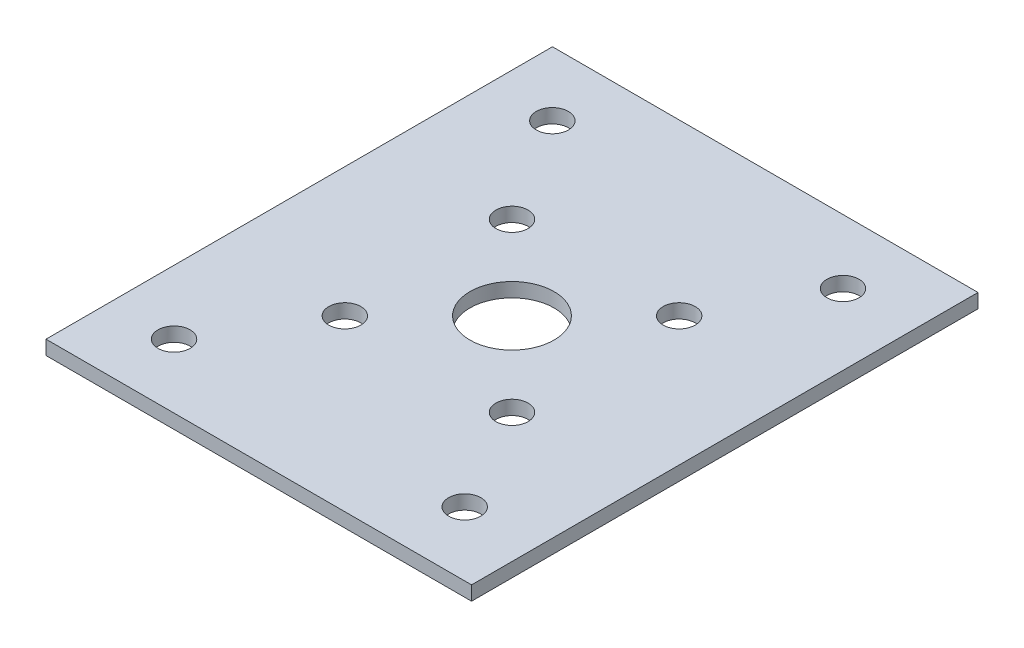
ISO-10303-21;
HEADER;
FILE_DESCRIPTION(('STEP AP214'),'2;1');
FILE_NAME('part.step','',(''),(''),'','','');
FILE_SCHEMA(('AUTOMOTIVE_DESIGN { 1 0 10303 214 1 1 1 1 }'));
ENDSEC;
DATA;
#1=APPLICATION_CONTEXT('core data for automotive mechanical design processes');
#2=APPLICATION_PROTOCOL_DEFINITION('international standard','automotive_design',2000,#1);
#3=PRODUCT_CONTEXT('',#1,'mechanical');
#4=PRODUCT('Part','Part','',(#3));
#5=PRODUCT_RELATED_PRODUCT_CATEGORY('part','',(#4));
#6=PRODUCT_DEFINITION_FORMATION('','',#4);
#7=PRODUCT_DEFINITION_CONTEXT('part definition',#1,'design');
#8=PRODUCT_DEFINITION('design','',#6,#7);
#9=PRODUCT_DEFINITION_SHAPE('','',#8);
#10=(LENGTH_UNIT() NAMED_UNIT(*) SI_UNIT(.MILLI.,.METRE.));
#11=(NAMED_UNIT(*) PLANE_ANGLE_UNIT() SI_UNIT($,.RADIAN.));
#12=(NAMED_UNIT(*) SI_UNIT($,.STERADIAN.) SOLID_ANGLE_UNIT());
#13=UNCERTAINTY_MEASURE_WITH_UNIT(LENGTH_MEASURE(1.E-05),#10,'distance_accuracy_value','');
#14=(GEOMETRIC_REPRESENTATION_CONTEXT(3) GLOBAL_UNCERTAINTY_ASSIGNED_CONTEXT((#13)) GLOBAL_UNIT_ASSIGNED_CONTEXT((#10,
#11,#12)) REPRESENTATION_CONTEXT('',''));
#15=CARTESIAN_POINT('',(0.,0.,0.));
#16=DIRECTION('',(0.,0.,1.));
#17=DIRECTION('',(1.,0.,0.));
#18=AXIS2_PLACEMENT_3D('',#15,#16,#17);
#19=CARTESIAN_POINT('',(0.,1.5,0.));
#20=DIRECTION('',(0.,-1.,0.));
#21=DIRECTION('',(0.,0.,-1.));
#22=AXIS2_PLACEMENT_3D('',#19,#20,#21);
#23=PLANE('',#22);
#24=CARTESIAN_POINT('',(0.,1.5,0.));
#25=DIRECTION('',(0.,1.,0.));
#26=DIRECTION('',(0.,0.,1.));
#27=AXIS2_PLACEMENT_3D('',#24,#25,#26);
#28=CIRCLE('',#27,4.445);
#29=CARTESIAN_POINT('',(0.,1.5,4.445));
#30=VERTEX_POINT('',#29);
#31=EDGE_CURVE('E159',#30,#30,#28,.T.);
#32=ORIENTED_EDGE('',*,*,#31,.F.);
#33=EDGE_LOOP('',(#32));
#34=FACE_BOUND('',#33,.T.);
#35=CARTESIAN_POINT('',(-8.8388347648318,1.5,-8.83883476483189));
#36=DIRECTION('',(0.,1.,0.));
#37=DIRECTION('',(0.,0.,1.));
#38=AXIS2_PLACEMENT_3D('',#35,#36,#37);
#39=CIRCLE('',#38,1.7);
#40=CARTESIAN_POINT('',(-8.8388347648318,1.5,-7.13883476483189));
#41=VERTEX_POINT('',#40);
#42=EDGE_CURVE('E156',#41,#41,#39,.T.);
#43=ORIENTED_EDGE('',*,*,#42,.F.);
#44=EDGE_LOOP('',(#43));
#45=FACE_BOUND('',#44,.T.);
#46=CARTESIAN_POINT('',(8.8388347648318,1.5,8.83883476483189));
#47=DIRECTION('',(0.,1.,0.));
#48=DIRECTION('',(0.,0.,1.));
#49=AXIS2_PLACEMENT_3D('',#46,#47,#48);
#50=CIRCLE('',#49,1.7);
#51=CARTESIAN_POINT('',(8.8388347648318,1.5,10.5388347648319));
#52=VERTEX_POINT('',#51);
#53=EDGE_CURVE('E150',#52,#52,#50,.T.);
#54=ORIENTED_EDGE('',*,*,#53,.F.);
#55=EDGE_LOOP('',(#54));
#56=FACE_BOUND('',#55,.T.);
#57=CARTESIAN_POINT('',(8.83883476483186,1.5,-8.83883476483183));
#58=DIRECTION('',(0.,1.,0.));
#59=DIRECTION('',(0.,0.,1.));
#60=AXIS2_PLACEMENT_3D('',#57,#58,#59);
#61=CIRCLE('',#60,1.7);
#62=CARTESIAN_POINT('',(8.83883476483186,1.5,-7.13883476483183));
#63=VERTEX_POINT('',#62);
#64=EDGE_CURVE('E144',#63,#63,#61,.T.);
#65=ORIENTED_EDGE('',*,*,#64,.F.);
#66=EDGE_LOOP('',(#65));
#67=FACE_BOUND('',#66,.T.);
#68=CARTESIAN_POINT('',(-8.83883476483186,1.5,8.83883476483183));
#69=DIRECTION('',(0.,1.,0.));
#70=DIRECTION('',(0.,0.,1.));
#71=AXIS2_PLACEMENT_3D('',#68,#69,#70);
#72=CIRCLE('',#71,1.7);
#73=CARTESIAN_POINT('',(-8.83883476483186,1.5,10.5388347648318));
#74=VERTEX_POINT('',#73);
#75=EDGE_CURVE('E138',#74,#74,#72,.T.);
#76=ORIENTED_EDGE('',*,*,#75,.F.);
#77=EDGE_LOOP('',(#76));
#78=FACE_BOUND('',#77,.T.);
#79=CARTESIAN_POINT('',(15.,1.5,20.));
#80=DIRECTION('',(0.,1.,0.));
#81=DIRECTION('',(0.,0.,1.));
#82=AXIS2_PLACEMENT_3D('',#79,#80,#81);
#83=CIRCLE('',#82,1.69999999999999);
#84=CARTESIAN_POINT('',(15.,1.5,21.7));
#85=VERTEX_POINT('',#84);
#86=EDGE_CURVE('E120',#85,#85,#83,.T.);
#87=ORIENTED_EDGE('',*,*,#86,.F.);
#88=EDGE_LOOP('',(#87));
#89=FACE_BOUND('',#88,.T.);
#90=DIRECTION('',(0.,0.,-1.));
#91=VECTOR('',#90,1.);
#92=CARTESIAN_POINT('',(22.5,1.5,26.778000038));
#93=LINE('',#92,#91);
#94=CARTESIAN_POINT('',(22.5,1.5,26.778000038));
#95=VERTEX_POINT('',#94);
#96=CARTESIAN_POINT('',(22.5,1.5,-26.778000038));
#97=VERTEX_POINT('',#96);
#98=EDGE_CURVE('E86',#95,#97,#93,.T.);
#99=ORIENTED_EDGE('',*,*,#98,.T.);
#100=DIRECTION('',(-1.,0.,0.));
#101=VECTOR('',#100,1.);
#102=CARTESIAN_POINT('',(-22.5,1.5,-26.778000038));
#103=LINE('',#102,#101);
#104=CARTESIAN_POINT('',(-22.5,1.5,-26.778000038));
#105=VERTEX_POINT('',#104);
#106=EDGE_CURVE('E81',#97,#105,#103,.T.);
#107=ORIENTED_EDGE('',*,*,#106,.T.);
#108=DIRECTION('',(0.,0.,1.));
#109=VECTOR('',#108,1.);
#110=CARTESIAN_POINT('',(-22.5,1.5,26.778000038));
#111=LINE('',#110,#109);
#112=CARTESIAN_POINT('',(-22.5,1.5,26.778000038));
#113=VERTEX_POINT('',#112);
#114=EDGE_CURVE('E84',#105,#113,#111,.T.);
#115=ORIENTED_EDGE('',*,*,#114,.T.);
#116=DIRECTION('',(1.,0.,0.));
#117=VECTOR('',#116,1.);
#118=CARTESIAN_POINT('',(-22.5,1.5,26.778000038));
#119=LINE('',#118,#117);
#120=EDGE_CURVE('E51',#113,#95,#119,.T.);
#121=ORIENTED_EDGE('',*,*,#120,.T.);
#122=EDGE_LOOP('',(#99,#107,#115,#121));
#123=FACE_BOUND('',#122,.T.);
#124=CARTESIAN_POINT('',(-15.736599944,1.5,20.));
#125=DIRECTION('',(0.,1.,0.));
#126=DIRECTION('',(0.,0.,1.));
#127=AXIS2_PLACEMENT_3D('',#124,#125,#126);
#128=CIRCLE('',#127,1.69999999999999);
#129=CARTESIAN_POINT('',(-15.736599944,1.5,21.7));
#130=VERTEX_POINT('',#129);
#131=EDGE_CURVE('E114',#130,#130,#128,.T.);
#132=ORIENTED_EDGE('',*,*,#131,.F.);
#133=EDGE_LOOP('',(#132));
#134=FACE_BOUND('',#133,.T.);
#135=CARTESIAN_POINT('',(15.,1.5,-20.));
#136=DIRECTION('',(0.,1.,0.));
#137=DIRECTION('',(0.,0.,1.));
#138=AXIS2_PLACEMENT_3D('',#135,#136,#137);
#139=CIRCLE('',#138,1.69999999999999);
#140=CARTESIAN_POINT('',(15.,1.5,-18.3));
#141=VERTEX_POINT('',#140);
#142=EDGE_CURVE('E126',#141,#141,#139,.T.);
#143=ORIENTED_EDGE('',*,*,#142,.F.);
#144=EDGE_LOOP('',(#143));
#145=FACE_BOUND('',#144,.T.);
#146=CARTESIAN_POINT('',(-15.736599944,1.5,-20.));
#147=DIRECTION('',(0.,1.,0.));
#148=DIRECTION('',(0.,0.,1.));
#149=AXIS2_PLACEMENT_3D('',#146,#147,#148);
#150=CIRCLE('',#149,1.69999999999999);
#151=CARTESIAN_POINT('',(-15.736599944,1.5,-18.3));
#152=VERTEX_POINT('',#151);
#153=EDGE_CURVE('E132',#152,#152,#150,.T.);
#154=ORIENTED_EDGE('',*,*,#153,.F.);
#155=EDGE_LOOP('',(#154));
#156=FACE_BOUND('',#155,.T.);
#157=ADVANCED_FACE('F34',(#34,#45,#56,#67,#78,#89,#123,#134,#145,#156),#23,.F.);
#158=CARTESIAN_POINT('',(22.5,1.5,26.778000038));
#159=DIRECTION('',(-1.,0.,0.));
#160=DIRECTION('',(0.,0.,1.));
#161=AXIS2_PLACEMENT_3D('',#158,#159,#160);
#162=PLANE('',#161);
#163=DIRECTION('',(0.,0.,-1.));
#164=VECTOR('',#163,1.);
#165=CARTESIAN_POINT('',(22.5,0.,26.778000038));
#166=LINE('',#165,#164);
#167=CARTESIAN_POINT('',(22.5,0.,26.778000038));
#168=VERTEX_POINT('',#167);
#169=CARTESIAN_POINT('',(22.5,0.,-26.778000038));
#170=VERTEX_POINT('',#169);
#171=EDGE_CURVE('E98',#168,#170,#166,.T.);
#172=ORIENTED_EDGE('',*,*,#171,.T.);
#173=DIRECTION('',(0.,-1.,0.));
#174=VECTOR('',#173,1.);
#175=CARTESIAN_POINT('',(22.5,1.5,-26.778000038));
#176=LINE('',#175,#174);
#177=EDGE_CURVE('E11',#97,#170,#176,.T.);
#178=ORIENTED_EDGE('',*,*,#177,.F.);
#179=ORIENTED_EDGE('',*,*,#98,.F.);
#180=DIRECTION('',(0.,-1.,0.));
#181=VECTOR('',#180,1.);
#182=CARTESIAN_POINT('',(22.5,1.5,26.778000038));
#183=LINE('',#182,#181);
#184=EDGE_CURVE('E94',#95,#168,#183,.T.);
#185=ORIENTED_EDGE('',*,*,#184,.T.);
#186=EDGE_LOOP('',(#172,#178,#179,#185));
#187=FACE_BOUND('',#186,.T.);
#188=ADVANCED_FACE('F36',(#187),#162,.F.);
#189=CARTESIAN_POINT('',(-22.5,1.5,-26.778000038));
#190=DIRECTION('',(0.,0.,1.));
#191=DIRECTION('',(1.,0.,0.));
#192=AXIS2_PLACEMENT_3D('',#189,#190,#191);
#193=PLANE('',#192);
#194=DIRECTION('',(-1.,0.,0.));
#195=VECTOR('',#194,1.);
#196=CARTESIAN_POINT('',(-22.5,0.,-26.778000038));
#197=LINE('',#196,#195);
#198=CARTESIAN_POINT('',(-22.5,0.,-26.778000038));
#199=VERTEX_POINT('',#198);
#200=EDGE_CURVE('E90',#170,#199,#197,.T.);
#201=ORIENTED_EDGE('',*,*,#200,.T.);
#202=DIRECTION('',(0.,-1.,0.));
#203=VECTOR('',#202,1.);
#204=CARTESIAN_POINT('',(-22.5,1.5,-26.778000038));
#205=LINE('',#204,#203);
#206=EDGE_CURVE('E43',#105,#199,#205,.T.);
#207=ORIENTED_EDGE('',*,*,#206,.F.);
#208=ORIENTED_EDGE('',*,*,#106,.F.);
#209=ORIENTED_EDGE('',*,*,#177,.T.);
#210=EDGE_LOOP('',(#201,#207,#208,#209));
#211=FACE_BOUND('',#210,.T.);
#212=ADVANCED_FACE('F89',(#211),#193,.F.);
#213=CARTESIAN_POINT('',(-22.5,1.5,26.778000038));
#214=DIRECTION('',(1.,0.,0.));
#215=DIRECTION('',(0.,0.,-1.));
#216=AXIS2_PLACEMENT_3D('',#213,#214,#215);
#217=PLANE('',#216);
#218=DIRECTION('',(0.,0.,1.));
#219=VECTOR('',#218,1.);
#220=CARTESIAN_POINT('',(-22.5,0.,26.778000038));
#221=LINE('',#220,#219);
#222=CARTESIAN_POINT('',(-22.5,0.,26.778000038));
#223=VERTEX_POINT('',#222);
#224=EDGE_CURVE('E68',#199,#223,#221,.T.);
#225=ORIENTED_EDGE('',*,*,#224,.T.);
#226=DIRECTION('',(0.,-1.,0.));
#227=VECTOR('',#226,1.);
#228=CARTESIAN_POINT('',(-22.5,1.5,26.778000038));
#229=LINE('',#228,#227);
#230=EDGE_CURVE('E91',#113,#223,#229,.T.);
#231=ORIENTED_EDGE('',*,*,#230,.F.);
#232=ORIENTED_EDGE('',*,*,#114,.F.);
#233=ORIENTED_EDGE('',*,*,#206,.T.);
#234=EDGE_LOOP('',(#225,#231,#232,#233));
#235=FACE_BOUND('',#234,.T.);
#236=ADVANCED_FACE('F92',(#235),#217,.F.);
#237=CARTESIAN_POINT('',(-22.5,1.5,26.778000038));
#238=DIRECTION('',(0.,0.,-1.));
#239=DIRECTION('',(-1.,0.,0.));
#240=AXIS2_PLACEMENT_3D('',#237,#238,#239);
#241=PLANE('',#240);
#242=DIRECTION('',(1.,0.,0.));
#243=VECTOR('',#242,1.);
#244=CARTESIAN_POINT('',(-22.5,0.,26.778000038));
#245=LINE('',#244,#243);
#246=EDGE_CURVE('E74',#223,#168,#245,.T.);
#247=ORIENTED_EDGE('',*,*,#246,.T.);
#248=ORIENTED_EDGE('',*,*,#184,.F.);
#249=ORIENTED_EDGE('',*,*,#120,.F.);
#250=ORIENTED_EDGE('',*,*,#230,.T.);
#251=EDGE_LOOP('',(#247,#248,#249,#250));
#252=FACE_BOUND('',#251,.T.);
#253=ADVANCED_FACE('F106',(#252),#241,.F.);
#254=CARTESIAN_POINT('',(0.,0.,0.));
#255=DIRECTION('',(0.,-1.,0.));
#256=DIRECTION('',(0.,0.,-1.));
#257=AXIS2_PLACEMENT_3D('',#254,#255,#256);
#258=PLANE('',#257);
#259=CARTESIAN_POINT('',(0.,0.,0.));
#260=DIRECTION('',(0.,-1.,0.));
#261=DIRECTION('',(0.,0.,-1.));
#262=AXIS2_PLACEMENT_3D('',#259,#260,#261);
#263=CIRCLE('',#262,4.445);
#264=CARTESIAN_POINT('',(0.,0.,-4.445));
#265=VERTEX_POINT('',#264);
#266=EDGE_CURVE('E160',#265,#265,#263,.F.);
#267=ORIENTED_EDGE('',*,*,#266,.T.);
#268=EDGE_LOOP('',(#267));
#269=FACE_BOUND('',#268,.T.);
#270=CARTESIAN_POINT('',(-8.8388347648318,0.,-8.83883476483189));
#271=DIRECTION('',(0.,1.,0.));
#272=DIRECTION('',(0.,0.,1.));
#273=AXIS2_PLACEMENT_3D('',#270,#271,#272);
#274=CIRCLE('',#273,1.7);
#275=CARTESIAN_POINT('',(-8.8388347648318,0.,-7.13883476483189));
#276=VERTEX_POINT('',#275);
#277=EDGE_CURVE('E153',#276,#276,#274,.T.);
#278=ORIENTED_EDGE('',*,*,#277,.T.);
#279=EDGE_LOOP('',(#278));
#280=FACE_BOUND('',#279,.T.);
#281=CARTESIAN_POINT('',(8.8388347648318,0.,8.83883476483189));
#282=DIRECTION('',(0.,1.,0.));
#283=DIRECTION('',(0.,0.,1.));
#284=AXIS2_PLACEMENT_3D('',#281,#282,#283);
#285=CIRCLE('',#284,1.7);
#286=CARTESIAN_POINT('',(8.8388347648318,0.,10.5388347648319));
#287=VERTEX_POINT('',#286);
#288=EDGE_CURVE('E147',#287,#287,#285,.T.);
#289=ORIENTED_EDGE('',*,*,#288,.T.);
#290=EDGE_LOOP('',(#289));
#291=FACE_BOUND('',#290,.T.);
#292=CARTESIAN_POINT('',(8.83883476483186,0.,-8.83883476483183));
#293=DIRECTION('',(0.,1.,0.));
#294=DIRECTION('',(0.,0.,1.));
#295=AXIS2_PLACEMENT_3D('',#292,#293,#294);
#296=CIRCLE('',#295,1.7);
#297=CARTESIAN_POINT('',(8.83883476483186,0.,-7.13883476483183));
#298=VERTEX_POINT('',#297);
#299=EDGE_CURVE('E141',#298,#298,#296,.T.);
#300=ORIENTED_EDGE('',*,*,#299,.T.);
#301=EDGE_LOOP('',(#300));
#302=FACE_BOUND('',#301,.T.);
#303=CARTESIAN_POINT('',(-8.83883476483186,0.,8.83883476483183));
#304=DIRECTION('',(0.,1.,0.));
#305=DIRECTION('',(0.,0.,1.));
#306=AXIS2_PLACEMENT_3D('',#303,#304,#305);
#307=CIRCLE('',#306,1.7);
#308=CARTESIAN_POINT('',(-8.83883476483186,0.,10.5388347648318));
#309=VERTEX_POINT('',#308);
#310=EDGE_CURVE('E135',#309,#309,#307,.T.);
#311=ORIENTED_EDGE('',*,*,#310,.T.);
#312=EDGE_LOOP('',(#311));
#313=FACE_BOUND('',#312,.T.);
#314=CARTESIAN_POINT('',(-15.736599944,0.,-20.));
#315=DIRECTION('',(0.,-1.,0.));
#316=DIRECTION('',(0.,0.,-1.));
#317=AXIS2_PLACEMENT_3D('',#314,#315,#316);
#318=CIRCLE('',#317,1.69999999999999);
#319=CARTESIAN_POINT('',(-15.736599944,0.,-21.7));
#320=VERTEX_POINT('',#319);
#321=EDGE_CURVE('E129',#320,#320,#318,.T.);
#322=ORIENTED_EDGE('',*,*,#321,.F.);
#323=EDGE_LOOP('',(#322));
#324=FACE_BOUND('',#323,.T.);
#325=CARTESIAN_POINT('',(15.,0.,-20.));
#326=DIRECTION('',(0.,-1.,0.));
#327=DIRECTION('',(0.,0.,-1.));
#328=AXIS2_PLACEMENT_3D('',#325,#326,#327);
#329=CIRCLE('',#328,1.69999999999999);
#330=CARTESIAN_POINT('',(15.,0.,-21.7));
#331=VERTEX_POINT('',#330);
#332=EDGE_CURVE('E123',#331,#331,#329,.T.);
#333=ORIENTED_EDGE('',*,*,#332,.F.);
#334=EDGE_LOOP('',(#333));
#335=FACE_BOUND('',#334,.T.);
#336=CARTESIAN_POINT('',(15.,0.,20.));
#337=DIRECTION('',(0.,-1.,0.));
#338=DIRECTION('',(0.,0.,-1.));
#339=AXIS2_PLACEMENT_3D('',#336,#337,#338);
#340=CIRCLE('',#339,1.69999999999999);
#341=CARTESIAN_POINT('',(15.,0.,18.3));
#342=VERTEX_POINT('',#341);
#343=EDGE_CURVE('E117',#342,#342,#340,.T.);
#344=ORIENTED_EDGE('',*,*,#343,.F.);
#345=EDGE_LOOP('',(#344));
#346=FACE_BOUND('',#345,.T.);
#347=CARTESIAN_POINT('',(-15.736599944,0.,20.));
#348=DIRECTION('',(0.,-1.,0.));
#349=DIRECTION('',(0.,0.,-1.));
#350=AXIS2_PLACEMENT_3D('',#347,#348,#349);
#351=CIRCLE('',#350,1.69999999999999);
#352=CARTESIAN_POINT('',(-15.736599944,0.,18.3));
#353=VERTEX_POINT('',#352);
#354=EDGE_CURVE('E101',#353,#353,#351,.T.);
#355=ORIENTED_EDGE('',*,*,#354,.F.);
#356=EDGE_LOOP('',(#355));
#357=FACE_BOUND('',#356,.T.);
#358=ORIENTED_EDGE('',*,*,#171,.F.);
#359=ORIENTED_EDGE('',*,*,#246,.F.);
#360=ORIENTED_EDGE('',*,*,#224,.F.);
#361=ORIENTED_EDGE('',*,*,#200,.F.);
#362=EDGE_LOOP('',(#358,#359,#360,#361));
#363=FACE_BOUND('',#362,.T.);
#364=ADVANCED_FACE('F109',(#269,#280,#291,#302,#313,#324,#335,#346,#357,#363),#258,.T.);
#365=CARTESIAN_POINT('',(-15.736599944,1.5,20.));
#366=DIRECTION('',(0.,1.,0.));
#367=DIRECTION('',(0.,0.,1.));
#368=AXIS2_PLACEMENT_3D('',#365,#366,#367);
#369=CYLINDRICAL_SURFACE('',#368,1.69999999999999);
#370=ORIENTED_EDGE('',*,*,#131,.T.);
#371=EDGE_LOOP('',(#370));
#372=FACE_BOUND('',#371,.T.);
#373=ORIENTED_EDGE('',*,*,#354,.T.);
#374=EDGE_LOOP('',(#373));
#375=FACE_BOUND('',#374,.T.);
#376=ADVANCED_FACE('F185',(#372,#375),#369,.F.);
#377=CARTESIAN_POINT('',(15.,1.5,20.));
#378=DIRECTION('',(0.,1.,0.));
#379=DIRECTION('',(0.,0.,1.));
#380=AXIS2_PLACEMENT_3D('',#377,#378,#379);
#381=CYLINDRICAL_SURFACE('',#380,1.69999999999999);
#382=ORIENTED_EDGE('',*,*,#86,.T.);
#383=EDGE_LOOP('',(#382));
#384=FACE_BOUND('',#383,.T.);
#385=ORIENTED_EDGE('',*,*,#343,.T.);
#386=EDGE_LOOP('',(#385));
#387=FACE_BOUND('',#386,.T.);
#388=ADVANCED_FACE('F181',(#384,#387),#381,.F.);
#389=CARTESIAN_POINT('',(15.,1.5,-20.));
#390=DIRECTION('',(0.,1.,0.));
#391=DIRECTION('',(0.,0.,1.));
#392=AXIS2_PLACEMENT_3D('',#389,#390,#391);
#393=CYLINDRICAL_SURFACE('',#392,1.69999999999999);
#394=ORIENTED_EDGE('',*,*,#142,.T.);
#395=EDGE_LOOP('',(#394));
#396=FACE_BOUND('',#395,.T.);
#397=ORIENTED_EDGE('',*,*,#332,.T.);
#398=EDGE_LOOP('',(#397));
#399=FACE_BOUND('',#398,.T.);
#400=ADVANCED_FACE('F184',(#396,#399),#393,.F.);
#401=CARTESIAN_POINT('',(-15.736599944,1.5,-20.));
#402=DIRECTION('',(0.,1.,0.));
#403=DIRECTION('',(0.,0.,1.));
#404=AXIS2_PLACEMENT_3D('',#401,#402,#403);
#405=CYLINDRICAL_SURFACE('',#404,1.69999999999999);
#406=ORIENTED_EDGE('',*,*,#153,.T.);
#407=EDGE_LOOP('',(#406));
#408=FACE_BOUND('',#407,.T.);
#409=ORIENTED_EDGE('',*,*,#321,.T.);
#410=EDGE_LOOP('',(#409));
#411=FACE_BOUND('',#410,.T.);
#412=ADVANCED_FACE('F265',(#408,#411),#405,.F.);
#413=CARTESIAN_POINT('',(-8.83883476483186,1.5,8.83883476483183));
#414=DIRECTION('',(0.,1.,0.));
#415=DIRECTION('',(0.,0.,1.));
#416=AXIS2_PLACEMENT_3D('',#413,#414,#415);
#417=CYLINDRICAL_SURFACE('',#416,1.7);
#418=ORIENTED_EDGE('',*,*,#310,.F.);
#419=EDGE_LOOP('',(#418));
#420=FACE_BOUND('',#419,.T.);
#421=ORIENTED_EDGE('',*,*,#75,.T.);
#422=EDGE_LOOP('',(#421));
#423=FACE_BOUND('',#422,.T.);
#424=ADVANCED_FACE('F257',(#420,#423),#417,.F.);
#425=CARTESIAN_POINT('',(8.83883476483186,1.5,-8.83883476483183));
#426=DIRECTION('',(0.,1.,0.));
#427=DIRECTION('',(0.,0.,1.));
#428=AXIS2_PLACEMENT_3D('',#425,#426,#427);
#429=CYLINDRICAL_SURFACE('',#428,1.7);
#430=ORIENTED_EDGE('',*,*,#299,.F.);
#431=EDGE_LOOP('',(#430));
#432=FACE_BOUND('',#431,.T.);
#433=ORIENTED_EDGE('',*,*,#64,.T.);
#434=EDGE_LOOP('',(#433));
#435=FACE_BOUND('',#434,.T.);
#436=ADVANCED_FACE('F249',(#432,#435),#429,.F.);
#437=CARTESIAN_POINT('',(8.8388347648318,1.5,8.83883476483189));
#438=DIRECTION('',(0.,1.,0.));
#439=DIRECTION('',(0.,0.,1.));
#440=AXIS2_PLACEMENT_3D('',#437,#438,#439);
#441=CYLINDRICAL_SURFACE('',#440,1.7);
#442=ORIENTED_EDGE('',*,*,#288,.F.);
#443=EDGE_LOOP('',(#442));
#444=FACE_BOUND('',#443,.T.);
#445=ORIENTED_EDGE('',*,*,#53,.T.);
#446=EDGE_LOOP('',(#445));
#447=FACE_BOUND('',#446,.T.);
#448=ADVANCED_FACE('F244',(#444,#447),#441,.F.);
#449=CARTESIAN_POINT('',(-8.8388347648318,1.5,-8.83883476483189));
#450=DIRECTION('',(0.,1.,0.));
#451=DIRECTION('',(0.,0.,1.));
#452=AXIS2_PLACEMENT_3D('',#449,#450,#451);
#453=CYLINDRICAL_SURFACE('',#452,1.7);
#454=ORIENTED_EDGE('',*,*,#277,.F.);
#455=EDGE_LOOP('',(#454));
#456=FACE_BOUND('',#455,.T.);
#457=ORIENTED_EDGE('',*,*,#42,.T.);
#458=EDGE_LOOP('',(#457));
#459=FACE_BOUND('',#458,.T.);
#460=ADVANCED_FACE('F223',(#456,#459),#453,.F.);
#461=CARTESIAN_POINT('',(0.,-0.000999999999999916,0.));
#462=DIRECTION('',(0.,1.,0.));
#463=DIRECTION('',(0.,0.,1.));
#464=AXIS2_PLACEMENT_3D('',#461,#462,#463);
#465=CYLINDRICAL_SURFACE('',#464,4.445);
#466=ORIENTED_EDGE('',*,*,#266,.F.);
#467=EDGE_LOOP('',(#466));
#468=FACE_BOUND('',#467,.T.);
#469=ORIENTED_EDGE('',*,*,#31,.T.);
#470=EDGE_LOOP('',(#469));
#471=FACE_BOUND('',#470,.T.);
#472=ADVANCED_FACE('F166',(#468,#471),#465,.F.);
#473=CLOSED_SHELL('',(#157,#188,#212,#236,#253,#364,#376,#388,#400,#412,#424,#436,#448,#460,#472));
#474=MANIFOLD_SOLID_BREP('B2',#473);
#475=ADVANCED_BREP_SHAPE_REPRESENTATION('',(#18,#474),#14);
#476=SHAPE_DEFINITION_REPRESENTATION(#9,#475);
ENDSEC;
END-ISO-10303-21;
